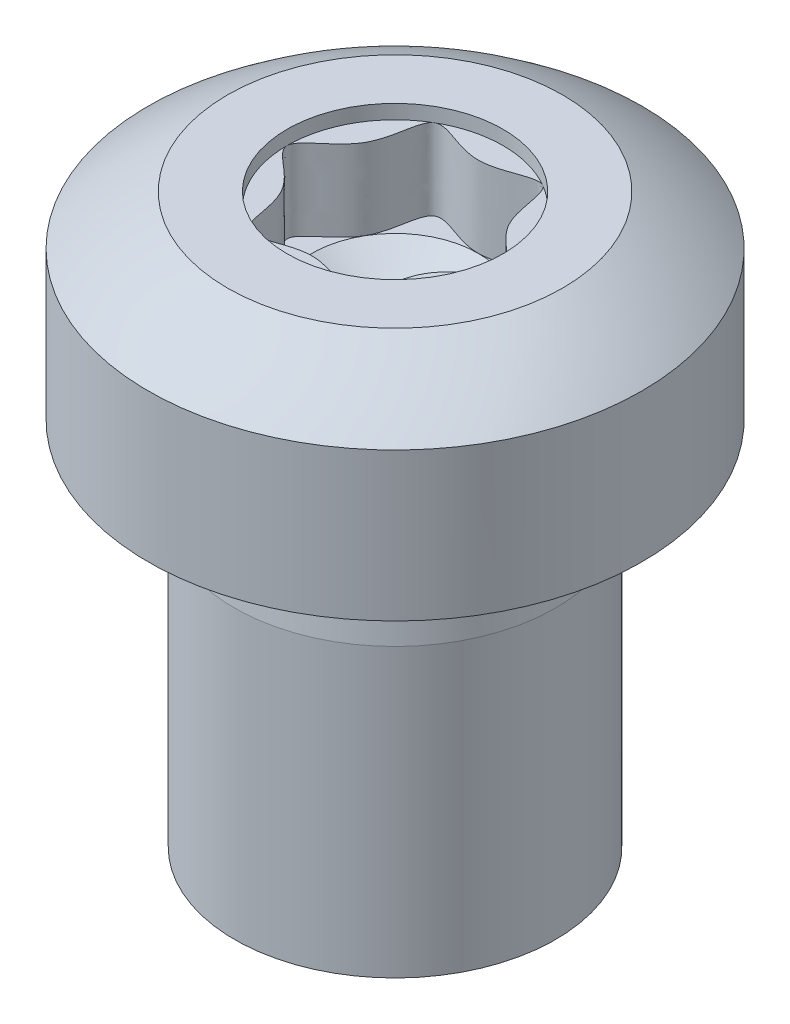
ISO-10303-21;
HEADER;
FILE_DESCRIPTION(('STEP AP214'),'2;1');
FILE_NAME('part.step','',(''),(''),'','','');
FILE_SCHEMA(('AUTOMOTIVE_DESIGN { 1 0 10303 214 1 1 1 1 }'));
ENDSEC;
DATA;
#1=APPLICATION_CONTEXT('core data for automotive mechanical design processes');
#2=APPLICATION_PROTOCOL_DEFINITION('international standard','automotive_design',2000,#1);
#3=PRODUCT_CONTEXT('',#1,'mechanical');
#4=PRODUCT('Part','Part','',(#3));
#5=PRODUCT_RELATED_PRODUCT_CATEGORY('part','',(#4));
#6=PRODUCT_DEFINITION_FORMATION('','',#4);
#7=PRODUCT_DEFINITION_CONTEXT('part definition',#1,'design');
#8=PRODUCT_DEFINITION('design','',#6,#7);
#9=PRODUCT_DEFINITION_SHAPE('','',#8);
#10=(LENGTH_UNIT() NAMED_UNIT(*) SI_UNIT(.MILLI.,.METRE.));
#11=(NAMED_UNIT(*) PLANE_ANGLE_UNIT() SI_UNIT($,.RADIAN.));
#12=(NAMED_UNIT(*) SI_UNIT($,.STERADIAN.) SOLID_ANGLE_UNIT());
#13=UNCERTAINTY_MEASURE_WITH_UNIT(LENGTH_MEASURE(1.E-05),#10,'distance_accuracy_value','');
#14=(GEOMETRIC_REPRESENTATION_CONTEXT(3) GLOBAL_UNCERTAINTY_ASSIGNED_CONTEXT((#13)) GLOBAL_UNIT_ASSIGNED_CONTEXT((#10,
#11,#12)) REPRESENTATION_CONTEXT('',''));
#15=CARTESIAN_POINT('',(0.,0.,0.));
#16=DIRECTION('',(0.,0.,1.));
#17=DIRECTION('',(1.,0.,0.));
#18=AXIS2_PLACEMENT_3D('',#15,#16,#17);
#19=CARTESIAN_POINT('',(2.,4.6,0.));
#20=DIRECTION('',(0.,1.,0.));
#21=DIRECTION('',(0.,0.,1.));
#22=AXIS2_PLACEMENT_3D('',#19,#20,#21);
#23=PLANE('',#22);
#24=CARTESIAN_POINT('',(0.,4.6,0.));
#25=DIRECTION('',(0.,1.,0.));
#26=DIRECTION('',(0.,0.,1.));
#27=AXIS2_PLACEMENT_3D('',#24,#25,#26);
#28=CIRCLE('',#27,0.875);
#29=CARTESIAN_POINT('',(0.,4.6,0.875));
#30=VERTEX_POINT('',#29);
#31=EDGE_CURVE('E106',#30,#30,#28,.T.);
#32=ORIENTED_EDGE('',*,*,#31,.F.);
#33=EDGE_LOOP('',(#32));
#34=FACE_BOUND('',#33,.T.);
#35=CARTESIAN_POINT('',(0.,4.6,0.));
#36=DIRECTION('',(0.,1.,0.));
#37=DIRECTION('',(0.,0.,1.));
#38=AXIS2_PLACEMENT_3D('',#35,#36,#37);
#39=CIRCLE('',#38,1.35705587228843);
#40=CARTESIAN_POINT('',(1.35705587228843,4.6,0.));
#41=VERTEX_POINT('',#40);
#42=EDGE_CURVE('E151',#41,#41,#39,.T.);
#43=ORIENTED_EDGE('',*,*,#42,.T.);
#44=EDGE_LOOP('',(#43));
#45=FACE_BOUND('',#44,.T.);
#46=ADVANCED_FACE('F34',(#34,#45),#23,.T.);
#47=CARTESIAN_POINT('',(0.,0.,0.));
#48=DIRECTION('',(0.,-1.,0.));
#49=DIRECTION('',(0.,0.,-1.));
#50=AXIS2_PLACEMENT_3D('',#47,#48,#49);
#51=CYLINDRICAL_SURFACE('',#50,2.);
#52=CARTESIAN_POINT('',(0.,3.,0.));
#53=DIRECTION('',(0.,-1.,0.));
#54=DIRECTION('',(0.,0.,-1.));
#55=AXIS2_PLACEMENT_3D('',#52,#53,#54);
#56=CIRCLE('',#55,2.);
#57=CARTESIAN_POINT('',(0.,3.,-2.));
#58=VERTEX_POINT('',#57);
#59=EDGE_CURVE('E143',#58,#58,#56,.T.);
#60=ORIENTED_EDGE('',*,*,#59,.F.);
#61=EDGE_LOOP('',(#60));
#62=FACE_BOUND('',#61,.T.);
#63=CARTESIAN_POINT('',(0.,4.2,0.));
#64=DIRECTION('',(0.,-1.,0.));
#65=DIRECTION('',(0.,0.,-1.));
#66=AXIS2_PLACEMENT_3D('',#63,#64,#65);
#67=CIRCLE('',#66,2.);
#68=CARTESIAN_POINT('',(2.,4.2,0.));
#69=VERTEX_POINT('',#68);
#70=EDGE_CURVE('E148',#69,#69,#67,.T.);
#71=ORIENTED_EDGE('',*,*,#70,.T.);
#72=EDGE_LOOP('',(#71));
#73=FACE_BOUND('',#72,.T.);
#74=ADVANCED_FACE('F198',(#62,#73),#51,.T.);
#75=CARTESIAN_POINT('',(1.3,3.,0.));
#76=DIRECTION('',(0.,-1.,0.));
#77=DIRECTION('',(0.,0.,-1.));
#78=AXIS2_PLACEMENT_3D('',#75,#76,#77);
#79=PLANE('',#78);
#80=ORIENTED_EDGE('',*,*,#59,.T.);
#81=EDGE_LOOP('',(#80));
#82=FACE_BOUND('',#81,.T.);
#83=CARTESIAN_POINT('',(0.,3.,0.));
#84=DIRECTION('',(0.,-1.,0.));
#85=DIRECTION('',(0.,0.,-1.));
#86=AXIS2_PLACEMENT_3D('',#83,#84,#85);
#87=CIRCLE('',#86,1.3);
#88=CARTESIAN_POINT('',(0.,3.,-1.3));
#89=VERTEX_POINT('',#88);
#90=EDGE_CURVE('E163',#89,#89,#87,.T.);
#91=ORIENTED_EDGE('',*,*,#90,.F.);
#92=EDGE_LOOP('',(#91));
#93=FACE_BOUND('',#92,.T.);
#94=ADVANCED_FACE('F194',(#82,#93),#79,.T.);
#95=CARTESIAN_POINT('',(0.,1.70200080064064,0.));
#96=DIRECTION('',(0.,-1.,0.));
#97=DIRECTION('',(1.,0.,0.));
#98=AXIS2_PLACEMENT_3D('',#95,#96,#97);
#99=SPHERICAL_SURFACE('',#98,3.2);
#100=CARTESIAN_POINT('',(2.,4.2,0.));
#101=CARTESIAN_POINT('',(1.99382822999277,4.20494137142535,0.));
#102=CARTESIAN_POINT('',(1.98763814642141,4.20985986920457,0.));
#103=CARTESIAN_POINT('',(1.97522169379547,4.21965084925044,0.));
#104=CARTESIAN_POINT('',(1.96899532474089,4.2245233315171,0.));
#105=CARTESIAN_POINT('',(1.95650664279357,4.23422201231761,0.));
#106=CARTESIAN_POINT('',(1.95024432990083,4.23904821085145,0.));
#107=CARTESIAN_POINT('',(1.93768410443105,4.24865405918617,0.));
#108=CARTESIAN_POINT('',(1.93138619185403,4.25343370898706,0.));
#109=CARTESIAN_POINT('',(1.91875511298224,4.26294619723154,0.));
#110=CARTESIAN_POINT('',(1.91242194668748,4.26767903567513,0.));
#111=CARTESIAN_POINT('',(1.89972070832191,4.27709764120107,0.));
#112=CARTESIAN_POINT('',(1.8933526362511,4.28178340828342,0.));
#113=CARTESIAN_POINT('',(1.88058193618249,4.2911076136559,0.));
#114=CARTESIAN_POINT('',(1.8741793081847,4.29574605194602,0.));
#115=CARTESIAN_POINT('',(1.86133984801239,4.30497534490675,0.));
#116=CARTESIAN_POINT('',(1.85490301583789,4.30956619957735,0.));
#117=CARTESIAN_POINT('',(1.84199550094081,4.31870007308493,0.));
#118=CARTESIAN_POINT('',(1.83552481821823,4.32324309192191,0.));
#119=CARTESIAN_POINT('',(1.82254995771357,4.33228104417644,0.));
#120=CARTESIAN_POINT('',(1.81604577993147,4.336775977594,0.));
#121=CARTESIAN_POINT('',(1.80300428663641,4.34571751206554,0.));
#122=CARTESIAN_POINT('',(1.79646697112344,4.35016411311952,0.));
#123=CARTESIAN_POINT('',(1.78335956151582,4.35900873857508,0.));
#124=CARTESIAN_POINT('',(1.77678946742118,4.36340676297665,0.));
#125=CARTESIAN_POINT('',(1.76361686160021,4.37215399350729,0.));
#126=CARTESIAN_POINT('',(1.75701434987388,4.37650319963635,0.));
#127=CARTESIAN_POINT('',(1.7437772715205,4.38515255468383,0.));
#128=CARTESIAN_POINT('',(1.73714270489345,4.38945270360225,0.));
#129=CARTESIAN_POINT('',(1.72384188123064,4.39800370798546,0.));
#130=CARTESIAN_POINT('',(1.71717562419488,4.40225456345025,0.));
#131=CARTESIAN_POINT('',(1.70381178594766,4.41070674739129,0.));
#132=CARTESIAN_POINT('',(1.69711420473621,4.41490807586755,0.));
#133=CARTESIAN_POINT('',(1.68368808609155,4.42326097501756,0.));
#134=CARTESIAN_POINT('',(1.67695954865833,4.42741254569131,0.));
#135=CARTESIAN_POINT('',(1.66347188722474,4.43566570115597,0.));
#136=CARTESIAN_POINT('',(1.65671276322437,4.43976728594686,0.));
#137=CARTESIAN_POINT('',(1.64316429999144,4.44792024431159,0.));
#138=CARTESIAN_POINT('',(1.63637496075889,4.45197161788541,0.));
#139=CARTESIAN_POINT('',(1.62276644005656,4.46002393124029,0.));
#140=CARTESIAN_POINT('',(1.61594725858678,4.46402487102134,0.));
#141=CARTESIAN_POINT('',(1.60227942804445,4.47197609698573,0.));
#142=CARTESIAN_POINT('',(1.59543077897188,4.47592638316907,0.));
#143=CARTESIAN_POINT('',(1.58170438947732,4.4837760849159,0.));
#144=CARTESIAN_POINT('',(1.57482664905531,4.4876755004794,0.));
#145=CARTESIAN_POINT('',(1.56104245471341,4.49542324675917,0.));
#146=CARTESIAN_POINT('',(1.55413600079352,4.49927157747545,0.));
#147=CARTESIAN_POINT('',(1.54029475888492,4.50691694263993,0.));
#148=CARTESIAN_POINT('',(1.5333599708962,4.51071397708814,0.));
#149=CARTESIAN_POINT('',(1.51946244183557,4.51825654111371,0.));
#150=CARTESIAN_POINT('',(1.51249970076366,4.52200207069106,0.));
#151=CARTESIAN_POINT('',(1.49854664805811,4.52944141920201,0.));
#152=CARTESIAN_POINT('',(1.49155633642448,4.5331352381356,0.));
#153=CARTESIAN_POINT('',(1.47754852663113,4.54047096242592,0.));
#154=CARTESIAN_POINT('',(1.47053102847141,4.54411286778265,0.));
#155=CARTESIAN_POINT('',(1.45646923115702,4.55134456484223,0.));
#156=CARTESIAN_POINT('',(1.44942493200236,4.55493435654508,0.));
#157=CARTESIAN_POINT('',(1.43530991969447,4.56206162906792,0.));
#158=CARTESIAN_POINT('',(1.42823920654124,4.56559910988791,0.));
#159=CARTESIAN_POINT('',(1.41407175471045,4.57262156634582,0.));
#160=CARTESIAN_POINT('',(1.40697501603287,4.57610654198375,0.));
#161=CARTESIAN_POINT('',(1.39275590295782,4.58302379645429,0.));
#162=CARTESIAN_POINT('',(1.38563352856033,4.5864560752869,0.));
#163=CARTESIAN_POINT('',(1.37136353562989,4.59326774819712,0.));
#164=CARTESIAN_POINT('',(1.36421591709692,4.59664714227473,0.));
#165=CARTESIAN_POINT('',(1.35705587228843,4.6,0.));
#166=B_SPLINE_CURVE_WITH_KNOTS('',3,(#100,#101,#102,#103,#104,#105,#106,#107,#108,#109,#110,
#111,#112,#113,#114,#115,#116,#117,#118,#119,#120,#121,#122,#123,#124,#125,#126,#127,#128,#129,
#130,#131,#132,#133,#134,#135,#136,#137,#138,#139,#140,#141,#142,#143,#144,#145,#146,#147,#148,
#149,#150,#151,#152,#153,#154,#155,#156,#157,#158,#159,#160,#161,#162,#163,#164,#165),
.UNSPECIFIED.,.F.,.F.,(4,2,2,2,2,2,2,2,2,2,2,2,2,2,2,2,2,2,2,2,2,2,2,2,2,2,2,2,2,2,2,2,4),(0.,
0.0237185263688886,0.0474370527377787,0.0711555791066665,0.0948741054755558,0.118592631844445,
0.142311158213334,0.166029684582223,0.189748210951112,0.213466737320001,0.237185263688891,
0.260903790057779,0.284622316426668,0.308340842795557,0.332059369164446,0.355777895533335,
0.379496421902225,0.403214948271113,0.426933474640002,0.450652001008891,0.474370527377781,
0.49808905374667,0.521807580115558,0.545526106484448,0.569244632853337,0.592963159222225,
0.616681685591114,0.640400211960004,0.664118738328892,0.687837264697782,0.71155579106667,
0.73527431743556,0.758992843804449),.UNSPECIFIED.);
#167=EDGE_CURVE('BSEAM190',#69,#41,#166,.T.);
#168=ORIENTED_EDGE('',*,*,#70,.F.);
#169=ORIENTED_EDGE('',*,*,#42,.F.);
#170=ORIENTED_EDGE('',*,*,#167,.T.);
#171=ORIENTED_EDGE('',*,*,#167,.F.);
#172=EDGE_LOOP('',(#168,#170,#169,#171));
#173=FACE_BOUND('',#172,.T.);
#174=ADVANCED_FACE('F190',(#173),#99,.T.);
#175=CARTESIAN_POINT('',(0.,2.32643678,0.));
#176=DIRECTION('',(0.,-1.,0.));
#177=DIRECTION('',(0.,0.,-1.));
#178=AXIS2_PLACEMENT_3D('',#175,#176,#177);
#179=CONICAL_SURFACE('',#178,1.3,0.0979868505757952);
#180=CARTESIAN_POINT('',(0.,2.9,0.));
#181=DIRECTION('',(0.,-1.,0.));
#182=DIRECTION('',(0.,0.,-1.));
#183=AXIS2_PLACEMENT_3D('',#180,#181,#182);
#184=CIRCLE('',#183,1.24361778101277);
#185=CARTESIAN_POINT('',(0.,2.9,-1.24361778101277));
#186=VERTEX_POINT('',#185);
#187=EDGE_CURVE('E158',#186,#186,#184,.T.);
#188=ORIENTED_EDGE('',*,*,#187,.T.);
#189=EDGE_LOOP('',(#188));
#190=FACE_BOUND('',#189,.T.);
#191=CARTESIAN_POINT('',(0.,2.32643678,0.));
#192=DIRECTION('',(0.,-1.,0.));
#193=DIRECTION('',(0.,0.,-1.));
#194=AXIS2_PLACEMENT_3D('',#191,#192,#193);
#195=CIRCLE('',#194,1.3);
#196=CARTESIAN_POINT('',(0.,2.32643678,-1.3));
#197=VERTEX_POINT('',#196);
#198=EDGE_CURVE('E153',#197,#197,#195,.T.);
#199=ORIENTED_EDGE('',*,*,#198,.F.);
#200=EDGE_LOOP('',(#199));
#201=FACE_BOUND('',#200,.T.);
#202=ADVANCED_FACE('F186',(#190,#201),#179,.T.);
#203=CARTESIAN_POINT('',(0.,2.90978301236365,0.));
#204=DIRECTION('',(0.,-1.,0.));
#205=DIRECTION('',(0.,0.,-1.));
#206=AXIS2_PLACEMENT_3D('',#203,#204,#205);
#207=TOROIDAL_SURFACE('',#206,1.34313809385941,0.1);
#208=ORIENTED_EDGE('',*,*,#90,.T.);
#209=EDGE_LOOP('',(#208));
#210=FACE_BOUND('',#209,.T.);
#211=ORIENTED_EDGE('',*,*,#187,.F.);
#212=EDGE_LOOP('',(#211));
#213=FACE_BOUND('',#212,.T.);
#214=ADVANCED_FACE('F183',(#210,#213),#207,.F.);
#215=CARTESIAN_POINT('',(0.,0.,0.));
#216=DIRECTION('',(0.,-1.,0.));
#217=DIRECTION('',(0.,0.,-1.));
#218=AXIS2_PLACEMENT_3D('',#215,#216,#217);
#219=PLANE('',#218);
#220=CARTESIAN_POINT('',(0.,0.,0.));
#221=DIRECTION('',(0.,-1.,0.));
#222=DIRECTION('',(0.,0.,-1.));
#223=AXIS2_PLACEMENT_3D('',#220,#221,#222);
#224=CIRCLE('',#223,1.3);
#225=CARTESIAN_POINT('',(0.,0.,-1.3));
#226=VERTEX_POINT('',#225);
#227=EDGE_CURVE('E138',#226,#226,#224,.T.);
#228=ORIENTED_EDGE('',*,*,#227,.T.);
#229=EDGE_LOOP('',(#228));
#230=FACE_BOUND('',#229,.T.);
#231=ADVANCED_FACE('F36',(#230),#219,.T.);
#232=CARTESIAN_POINT('',(0.,0.,0.));
#233=DIRECTION('',(0.,-1.,0.));
#234=DIRECTION('',(0.,0.,-1.));
#235=AXIS2_PLACEMENT_3D('',#232,#233,#234);
#236=CYLINDRICAL_SURFACE('',#235,1.3);
#237=ORIENTED_EDGE('',*,*,#227,.F.);
#238=EDGE_LOOP('',(#237));
#239=FACE_BOUND('',#238,.T.);
#240=ORIENTED_EDGE('',*,*,#198,.T.);
#241=EDGE_LOOP('',(#240));
#242=FACE_BOUND('',#241,.T.);
#243=ADVANCED_FACE('F205',(#239,#242),#236,.T.);
#244=CARTESIAN_POINT('',(0.,4.4845,0.));
#245=DIRECTION('',(0.,1.,0.));
#246=DIRECTION('',(0.,0.,1.));
#247=AXIS2_PLACEMENT_3D('',#244,#245,#246);
#248=CYLINDRICAL_SURFACE('',#247,0.875);
#249=ORIENTED_EDGE('',*,*,#31,.T.);
#250=EDGE_LOOP('',(#249));
#251=FACE_BOUND('',#250,.T.);
#252=CARTESIAN_POINT('',(0.,4.4845,0.));
#253=DIRECTION('',(0.,1.,0.));
#254=DIRECTION('',(0.,0.,1.));
#255=AXIS2_PLACEMENT_3D('',#252,#253,#254);
#256=CIRCLE('',#255,0.875);
#257=CARTESIAN_POINT('',(-0.437500000000021,4.4845,-0.757772228311372));
#258=VERTEX_POINT('',#257);
#259=CARTESIAN_POINT('',(-0.875,4.4845,0.));
#260=VERTEX_POINT('',#259);
#261=EDGE_CURVE('E392',#258,#260,#256,.T.);
#262=ORIENTED_EDGE('',*,*,#261,.F.);
#263=CARTESIAN_POINT('',(0.437499999999975,4.4845,-0.757772228311398));
#264=VERTEX_POINT('',#263);
#265=EDGE_CURVE('E394',#264,#258,#256,.T.);
#266=ORIENTED_EDGE('',*,*,#265,.F.);
#267=CARTESIAN_POINT('',(0.875,4.4845,0.));
#268=VERTEX_POINT('',#267);
#269=EDGE_CURVE('E113',#268,#264,#256,.T.);
#270=ORIENTED_EDGE('',*,*,#269,.F.);
#271=CARTESIAN_POINT('',(0.437500000000008,4.4845,0.757772228311379));
#272=VERTEX_POINT('',#271);
#273=EDGE_CURVE('E96',#272,#268,#256,.T.);
#274=ORIENTED_EDGE('',*,*,#273,.F.);
#275=CARTESIAN_POINT('',(-0.437499999999995,4.4845,0.757772228311386));
#276=VERTEX_POINT('',#275);
#277=EDGE_CURVE('E102',#276,#272,#256,.T.);
#278=ORIENTED_EDGE('',*,*,#277,.F.);
#279=EDGE_CURVE('E51',#260,#276,#256,.T.);
#280=ORIENTED_EDGE('',*,*,#279,.F.);
#281=EDGE_LOOP('',(#262,#266,#270,#274,#278,#280));
#282=FACE_BOUND('',#281,.T.);
#283=ADVANCED_FACE('F110',(#251,#282),#248,.F.);
#284=CARTESIAN_POINT('',(0.,4.4845,0.));
#285=DIRECTION('',(0.,1.,0.));
#286=DIRECTION('',(0.,0.,1.));
#287=AXIS2_PLACEMENT_3D('',#284,#285,#286);
#288=PLANE('',#287);
#289=ORIENTED_EDGE('',*,*,#277,.T.);
#290=CARTESIAN_POINT('',(-0.437499999999996,4.4845,0.757772228311386));
#291=CARTESIAN_POINT('',(-0.515892835103283,4.4845,0.712512103861968));
#292=CARTESIAN_POINT('',(-0.470357010619726,4.4845,0.271560746696529));
#293=CARTESIAN_POINT('',(-1.07732149469014,4.4845,0.));
#294=CARTESIAN_POINT('',(-0.470357010619726,4.4845,-0.271560746696519));
#295=CARTESIAN_POINT('',(-0.538660747345105,4.4845,-0.932987782444694));
#296=CARTESIAN_POINT('',(0.,4.4845,-0.543121493393037));
#297=CARTESIAN_POINT('',(0.538660747345043,4.4845,-0.9329877824447));
#298=CARTESIAN_POINT('',(0.470357010619701,4.4845,-0.271560746696524));
#299=CARTESIAN_POINT('',(1.07732149469015,4.4845,0.));
#300=CARTESIAN_POINT('',(0.470357010619713,4.4845,0.271560746696512));
#301=CARTESIAN_POINT('',(0.538660747345075,4.4845,0.932987782444663));
#302=CARTESIAN_POINT('',(0.,4.4845,0.543121493393047));
#303=CARTESIAN_POINT('',(-0.359107164896708,4.4845,0.803032352760805));
#304=CARTESIAN_POINT('',(-0.437499999999996,4.4845,0.757772228311386));
#305=B_SPLINE_CURVE_WITH_KNOTS('',3,(#290,#291,#292,#293,#294,#295,#296,#297,#298,#299,#300,
#301,#302,#303,#304),.UNSPECIFIED.,.T.,.F.,(4,1,1,1,1,1,1,1,1,1,1,1,4),(0.,0.083333333333333,
0.166666666666667,0.249999999999998,0.333333333333331,0.416666666666669,0.499999999999998,
0.583333333333334,0.66666666666667,0.750000000000003,0.833333333333334,0.916666666666667,1.),.UNSPECIFIED.);
#306=EDGE_CURVE('E11',#276,#272,#305,.F.);
#307=ORIENTED_EDGE('',*,*,#306,.F.);
#308=EDGE_LOOP('',(#289,#307));
#309=FACE_BOUND('',#308,.T.);
#310=ADVANCED_FACE('F103',(#309),#288,.T.);
#311=ORIENTED_EDGE('',*,*,#273,.T.);
#312=EDGE_CURVE('E45',#272,#268,#305,.F.);
#313=ORIENTED_EDGE('',*,*,#312,.F.);
#314=EDGE_LOOP('',(#311,#313));
#315=FACE_BOUND('',#314,.T.);
#316=ADVANCED_FACE('F94',(#315),#288,.T.);
#317=ORIENTED_EDGE('',*,*,#269,.T.);
#318=EDGE_CURVE('E99',#268,#264,#305,.F.);
#319=ORIENTED_EDGE('',*,*,#318,.F.);
#320=EDGE_LOOP('',(#317,#319));
#321=FACE_BOUND('',#320,.T.);
#322=ADVANCED_FACE('F273',(#321),#288,.T.);
#323=ORIENTED_EDGE('',*,*,#265,.T.);
#324=EDGE_CURVE('E119',#264,#258,#305,.F.);
#325=ORIENTED_EDGE('',*,*,#324,.F.);
#326=EDGE_LOOP('',(#323,#325));
#327=FACE_BOUND('',#326,.T.);
#328=ADVANCED_FACE('F281',(#327),#288,.T.);
#329=ORIENTED_EDGE('',*,*,#261,.T.);
#330=EDGE_CURVE('E117',#258,#260,#305,.F.);
#331=ORIENTED_EDGE('',*,*,#330,.F.);
#332=EDGE_LOOP('',(#329,#331));
#333=FACE_BOUND('',#332,.T.);
#334=ADVANCED_FACE('F290',(#333),#288,.T.);
#335=ORIENTED_EDGE('',*,*,#279,.T.);
#336=EDGE_CURVE('E38',#260,#276,#305,.F.);
#337=ORIENTED_EDGE('',*,*,#336,.F.);
#338=EDGE_LOOP('',(#335,#337));
#339=FACE_BOUND('',#338,.T.);
#340=ADVANCED_FACE('F265',(#339),#288,.T.);
#341=CARTESIAN_POINT('',(0.,3.44139885727621,0.));
#342=DIRECTION('',(0.,1.,0.));
#343=DIRECTION('',(0.,0.,1.));
#344=AXIS2_PLACEMENT_3D('',#341,#342,#343);
#345=CONICAL_SURFACE('',#344,0.,1.04719755119659);
#346=CARTESIAN_POINT('',(0.,3.83,0.));
#347=DIRECTION('',(0.,-1.,0.));
#348=DIRECTION('',(0.,0.,-1.));
#349=AXIS2_PLACEMENT_3D('',#346,#347,#348);
#350=CIRCLE('',#349,0.673076923076923);
#351=CARTESIAN_POINT('',(0.,3.83,-0.673076923076923));
#352=VERTEX_POINT('',#351);
#353=CARTESIAN_POINT('',(0.582901714085674,3.83,-0.336538461538472));
#354=VERTEX_POINT('',#353);
#355=EDGE_CURVE('E59',#352,#354,#350,.T.);
#356=ORIENTED_EDGE('',*,*,#355,.F.);
#357=CARTESIAN_POINT('',(-0.582901714085686,3.83,-0.33653846153845));
#358=VERTEX_POINT('',#357);
#359=EDGE_CURVE('E131',#358,#352,#350,.T.);
#360=ORIENTED_EDGE('',*,*,#359,.F.);
#361=CARTESIAN_POINT('',(-0.582901714085678,3.83,0.336538461538464));
#362=VERTEX_POINT('',#361);
#363=EDGE_CURVE('E137',#362,#358,#350,.T.);
#364=ORIENTED_EDGE('',*,*,#363,.F.);
#365=CARTESIAN_POINT('',(0.,3.83,0.673076923076923));
#366=VERTEX_POINT('',#365);
#367=EDGE_CURVE('E127',#366,#362,#350,.T.);
#368=ORIENTED_EDGE('',*,*,#367,.F.);
#369=CARTESIAN_POINT('',(0.582901714085681,3.83,0.336538461538459));
#370=VERTEX_POINT('',#369);
#371=EDGE_CURVE('E121',#370,#366,#350,.T.);
#372=ORIENTED_EDGE('',*,*,#371,.F.);
#373=EDGE_CURVE('E118',#354,#370,#350,.T.);
#374=ORIENTED_EDGE('',*,*,#373,.F.);
#375=EDGE_LOOP('',(#356,#360,#364,#368,#372,#374));
#376=FACE_BOUND('',#375,.T.);
#377=CARTESIAN_POINT('',(0.,3.44139885727621,0.));
#378=VERTEX_POINT('',#377);
#379=VERTEX_LOOP('',#378);
#380=FACE_BOUND('',#379,.T.);
#381=ADVANCED_FACE('F248',(#376,#380),#345,.F.);
#382=CARTESIAN_POINT('',(0.,3.83,0.));
#383=DIRECTION('',(0.,1.,0.));
#384=DIRECTION('',(0.,0.,1.));
#385=AXIS2_PLACEMENT_3D('',#382,#383,#384);
#386=PLANE('',#385);
#387=CARTESIAN_POINT('',(-0.437499999999996,3.83,0.757772228311386));
#388=CARTESIAN_POINT('',(-0.515892835103283,3.83,0.712512103861968));
#389=CARTESIAN_POINT('',(-0.470357010619726,3.83,0.271560746696529));
#390=CARTESIAN_POINT('',(-1.07732149469014,3.83,0.));
#391=CARTESIAN_POINT('',(-0.470357010619726,3.83,-0.271560746696519));
#392=CARTESIAN_POINT('',(-0.538660747345105,3.83,-0.932987782444694));
#393=CARTESIAN_POINT('',(0.,3.83,-0.543121493393037));
#394=CARTESIAN_POINT('',(0.538660747345043,3.83,-0.9329877824447));
#395=CARTESIAN_POINT('',(0.470357010619701,3.83,-0.271560746696524));
#396=CARTESIAN_POINT('',(1.07732149469015,3.83,0.));
#397=CARTESIAN_POINT('',(0.470357010619713,3.83,0.271560746696512));
#398=CARTESIAN_POINT('',(0.538660747345075,3.83,0.932987782444663));
#399=CARTESIAN_POINT('',(0.,3.83,0.543121493393047));
#400=CARTESIAN_POINT('',(-0.359107164896708,3.83,0.803032352760805));
#401=CARTESIAN_POINT('',(-0.437499999999996,3.83,0.757772228311386));
#402=B_SPLINE_CURVE_WITH_KNOTS('',3,(#387,#388,#389,#390,#391,#392,#393,#394,#395,#396,#397,
#398,#399,#400,#401),.UNSPECIFIED.,.T.,.F.,(4,1,1,1,1,1,1,1,1,1,1,1,4),(0.,0.083333333333333,
0.166666666666667,0.249999999999998,0.333333333333331,0.416666666666669,0.499999999999998,
0.583333333333334,0.66666666666667,0.750000000000003,0.833333333333334,0.916666666666667,1.),.UNSPECIFIED.);
#403=EDGE_CURVE('E130',#366,#362,#402,.T.);
#404=ORIENTED_EDGE('',*,*,#403,.F.);
#405=ORIENTED_EDGE('',*,*,#367,.T.);
#406=EDGE_LOOP('',(#404,#405));
#407=FACE_BOUND('',#406,.T.);
#408=ADVANCED_FACE('F320',(#407),#386,.T.);
#409=EDGE_CURVE('E135',#370,#366,#402,.T.);
#410=ORIENTED_EDGE('',*,*,#409,.F.);
#411=ORIENTED_EDGE('',*,*,#371,.T.);
#412=EDGE_LOOP('',(#410,#411));
#413=FACE_BOUND('',#412,.T.);
#414=ADVANCED_FACE('F336',(#413),#386,.T.);
#415=EDGE_CURVE('E371',#354,#370,#402,.T.);
#416=ORIENTED_EDGE('',*,*,#415,.F.);
#417=ORIENTED_EDGE('',*,*,#373,.T.);
#418=EDGE_LOOP('',(#416,#417));
#419=FACE_BOUND('',#418,.T.);
#420=ADVANCED_FACE('F330',(#419),#386,.T.);
#421=EDGE_CURVE('E372',#352,#354,#402,.T.);
#422=ORIENTED_EDGE('',*,*,#421,.F.);
#423=ORIENTED_EDGE('',*,*,#355,.T.);
#424=EDGE_LOOP('',(#422,#423));
#425=FACE_BOUND('',#424,.T.);
#426=ADVANCED_FACE('F181',(#425),#386,.T.);
#427=EDGE_CURVE('E171',#358,#352,#402,.T.);
#428=ORIENTED_EDGE('',*,*,#427,.F.);
#429=ORIENTED_EDGE('',*,*,#359,.T.);
#430=EDGE_LOOP('',(#428,#429));
#431=FACE_BOUND('',#430,.T.);
#432=ADVANCED_FACE('F318',(#431),#386,.T.);
#433=EDGE_CURVE('E136',#362,#358,#402,.T.);
#434=ORIENTED_EDGE('',*,*,#433,.F.);
#435=ORIENTED_EDGE('',*,*,#363,.T.);
#436=EDGE_LOOP('',(#434,#435));
#437=FACE_BOUND('',#436,.T.);
#438=ADVANCED_FACE('F179',(#437),#386,.T.);
#439=DIRECTION('',(0.,1.,0.));
#440=VECTOR('',#439,1.);
#441=SURFACE_OF_LINEAR_EXTRUSION('',#402,#440);
#442=ORIENTED_EDGE('',*,*,#433,.T.);
#443=ORIENTED_EDGE('',*,*,#427,.T.);
#444=ORIENTED_EDGE('',*,*,#421,.T.);
#445=ORIENTED_EDGE('',*,*,#415,.T.);
#446=ORIENTED_EDGE('',*,*,#409,.T.);
#447=ORIENTED_EDGE('',*,*,#403,.T.);
#448=EDGE_LOOP('',(#442,#443,#444,#445,#446,#447));
#449=FACE_BOUND('',#448,.T.);
#450=ORIENTED_EDGE('',*,*,#336,.T.);
#451=ORIENTED_EDGE('',*,*,#306,.T.);
#452=ORIENTED_EDGE('',*,*,#312,.T.);
#453=ORIENTED_EDGE('',*,*,#318,.T.);
#454=ORIENTED_EDGE('',*,*,#324,.T.);
#455=ORIENTED_EDGE('',*,*,#330,.T.);
#456=EDGE_LOOP('',(#450,#451,#452,#453,#454,#455));
#457=FACE_BOUND('',#456,.T.);
#458=ADVANCED_FACE('F114',(#449,#457),#441,.T.);
#459=CLOSED_SHELL('',(#46,#74,#94,#174,#202,#214,#231,#243,#283,#310,#316,#322,#328,#334,#340,
#381,#408,#414,#420,#426,#432,#438,#458));
#460=MANIFOLD_SOLID_BREP('B2',#459);
#461=ADVANCED_BREP_SHAPE_REPRESENTATION('',(#18,#460),#14);
#462=SHAPE_DEFINITION_REPRESENTATION(#9,#461);
ENDSEC;
END-ISO-10303-21;
